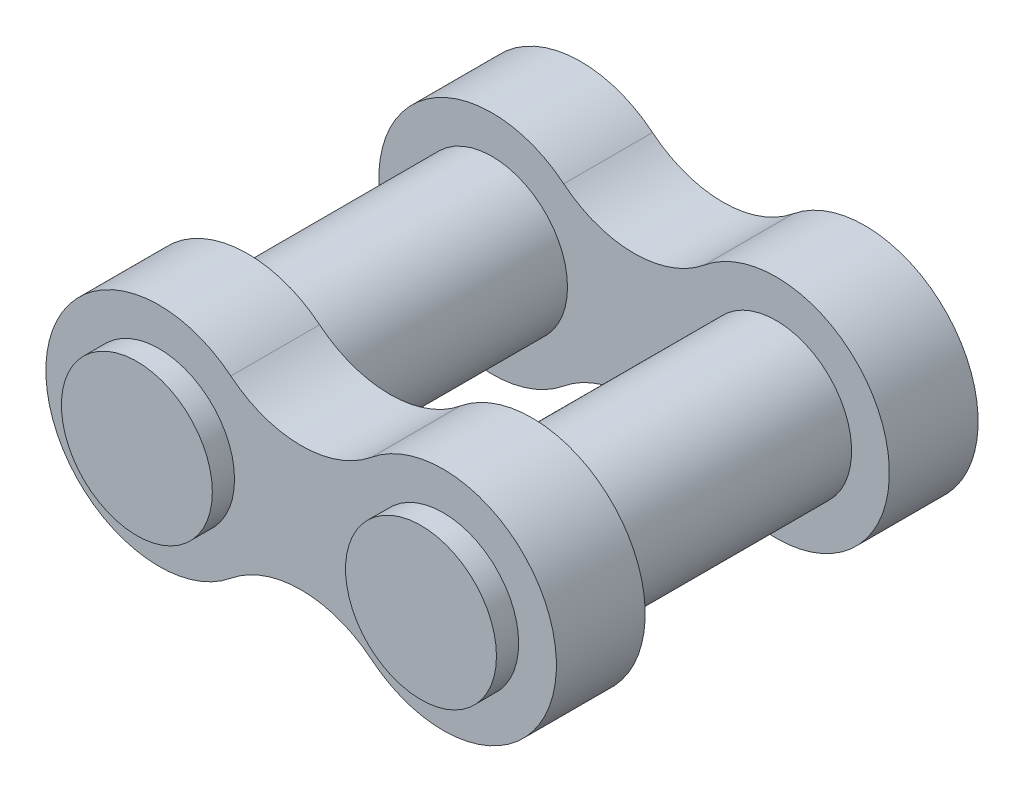
ISO-10303-21;
HEADER;
FILE_DESCRIPTION(('STEP AP214'),'2;1');
FILE_NAME('part.step','',(''),(''),'','','');
FILE_SCHEMA(('AUTOMOTIVE_DESIGN { 1 0 10303 214 1 1 1 1 }'));
ENDSEC;
DATA;
#1=APPLICATION_CONTEXT('core data for automotive mechanical design processes');
#2=APPLICATION_PROTOCOL_DEFINITION('international standard','automotive_design',2000,#1);
#3=PRODUCT_CONTEXT('',#1,'mechanical');
#4=PRODUCT('Part','Part','',(#3));
#5=PRODUCT_RELATED_PRODUCT_CATEGORY('part','',(#4));
#6=PRODUCT_DEFINITION_FORMATION('','',#4);
#7=PRODUCT_DEFINITION_CONTEXT('part definition',#1,'design');
#8=PRODUCT_DEFINITION('design','',#6,#7);
#9=PRODUCT_DEFINITION_SHAPE('','',#8);
#10=(LENGTH_UNIT() NAMED_UNIT(*) SI_UNIT(.MILLI.,.METRE.));
#11=(NAMED_UNIT(*) PLANE_ANGLE_UNIT() SI_UNIT($,.RADIAN.));
#12=(NAMED_UNIT(*) SI_UNIT($,.STERADIAN.) SOLID_ANGLE_UNIT());
#13=UNCERTAINTY_MEASURE_WITH_UNIT(LENGTH_MEASURE(1.E-05),#10,'distance_accuracy_value','');
#14=(GEOMETRIC_REPRESENTATION_CONTEXT(3) GLOBAL_UNCERTAINTY_ASSIGNED_CONTEXT((#13)) GLOBAL_UNIT_ASSIGNED_CONTEXT((#10,
#11,#12)) REPRESENTATION_CONTEXT('',''));
#15=CARTESIAN_POINT('',(0.,0.,0.));
#16=DIRECTION('',(0.,0.,1.));
#17=DIRECTION('',(1.,0.,0.));
#18=AXIS2_PLACEMENT_3D('',#15,#16,#17);
#19=CARTESIAN_POINT('',(1.6,1.95336248556176,2.));
#20=DIRECTION('',(0.,0.,1.));
#21=DIRECTION('',(1.,0.,0.));
#22=AXIS2_PLACEMENT_3D('',#19,#20,#21);
#23=PLANE('',#22);
#24=CARTESIAN_POINT('',(-3.2,0.,2.));
#25=DIRECTION('',(0.,0.,1.));
#26=DIRECTION('',(1.,0.,0.));
#27=AXIS2_PLACEMENT_3D('',#24,#25,#26);
#28=CIRCLE('',#27,1.7);
#29=CARTESIAN_POINT('',(-1.5,0.,2.));
#30=VERTEX_POINT('',#29);
#31=EDGE_CURVE('E179',#30,#30,#28,.T.);
#32=ORIENTED_EDGE('',*,*,#31,.F.);
#33=EDGE_LOOP('',(#32));
#34=FACE_BOUND('',#33,.T.);
#35=CARTESIAN_POINT('',(0.,3.90672497112351,2.));
#36=DIRECTION('',(0.,0.,-1.));
#37=DIRECTION('',(1.,0.,0.));
#38=AXIS2_PLACEMENT_3D('',#35,#36,#37);
#39=CIRCLE('',#38,2.5);
#40=CARTESIAN_POINT('',(1.58415841584159,1.97270270819108,2.));
#41=VERTEX_POINT('',#40);
#42=CARTESIAN_POINT('',(-1.58415841584158,1.97270270819108,2.));
#43=VERTEX_POINT('',#42);
#44=EDGE_CURVE('E184',#41,#43,#39,.T.);
#45=ORIENTED_EDGE('',*,*,#44,.T.);
#46=CARTESIAN_POINT('',(-3.2,0.,2.));
#47=DIRECTION('',(0.,0.,1.));
#48=DIRECTION('',(1.,0.,0.));
#49=AXIS2_PLACEMENT_3D('',#46,#47,#48);
#50=CIRCLE('',#49,2.55);
#51=CARTESIAN_POINT('',(-1.58415841584158,-1.97270270819108,2.));
#52=VERTEX_POINT('',#51);
#53=EDGE_CURVE('E86',#43,#52,#50,.T.);
#54=ORIENTED_EDGE('',*,*,#53,.T.);
#55=CARTESIAN_POINT('',(0.,-3.90672497112351,2.));
#56=DIRECTION('',(0.,0.,-1.));
#57=DIRECTION('',(-1.,0.,0.));
#58=AXIS2_PLACEMENT_3D('',#55,#56,#57);
#59=CIRCLE('',#58,2.5);
#60=CARTESIAN_POINT('',(1.58415841584159,-1.97270270819108,2.));
#61=VERTEX_POINT('',#60);
#62=EDGE_CURVE('E190',#52,#61,#59,.T.);
#63=ORIENTED_EDGE('',*,*,#62,.T.);
#64=CARTESIAN_POINT('',(3.2,0.,2.));
#65=DIRECTION('',(0.,0.,1.));
#66=DIRECTION('',(-1.,0.,0.));
#67=AXIS2_PLACEMENT_3D('',#64,#65,#66);
#68=CIRCLE('',#67,2.55);
#69=EDGE_CURVE('E57',#61,#41,#68,.T.);
#70=ORIENTED_EDGE('',*,*,#69,.T.);
#71=EDGE_LOOP('',(#45,#54,#63,#70));
#72=FACE_BOUND('',#71,.T.);
#73=CARTESIAN_POINT('',(3.2,0.,2.));
#74=DIRECTION('',(0.,0.,1.));
#75=DIRECTION('',(-1.,0.,0.));
#76=AXIS2_PLACEMENT_3D('',#73,#74,#75);
#77=CIRCLE('',#76,1.7);
#78=CARTESIAN_POINT('',(1.5,0.,2.));
#79=VERTEX_POINT('',#78);
#80=EDGE_CURVE('E180',#79,#79,#77,.T.);
#81=ORIENTED_EDGE('',*,*,#80,.F.);
#82=EDGE_LOOP('',(#81));
#83=FACE_BOUND('',#82,.T.);
#84=ADVANCED_FACE('F39',(#34,#72,#83),#23,.T.);
#85=CARTESIAN_POINT('',(1.6,1.95336248556176,0.));
#86=DIRECTION('',(0.,0.,1.));
#87=DIRECTION('',(1.,0.,0.));
#88=AXIS2_PLACEMENT_3D('',#85,#86,#87);
#89=PLANE('',#88);
#90=CARTESIAN_POINT('',(0.,3.90672497112351,0.));
#91=DIRECTION('',(0.,0.,-1.));
#92=DIRECTION('',(1.,0.,0.));
#93=AXIS2_PLACEMENT_3D('',#90,#91,#92);
#94=CIRCLE('',#93,2.5);
#95=CARTESIAN_POINT('',(1.58415841584159,1.97270270819108,0.));
#96=VERTEX_POINT('',#95);
#97=CARTESIAN_POINT('',(-1.58415841584158,1.97270270819108,0.));
#98=VERTEX_POINT('',#97);
#99=EDGE_CURVE('E181',#96,#98,#94,.T.);
#100=ORIENTED_EDGE('',*,*,#99,.F.);
#101=CARTESIAN_POINT('',(3.2,0.,0.));
#102=DIRECTION('',(0.,0.,1.));
#103=DIRECTION('',(-1.,0.,0.));
#104=AXIS2_PLACEMENT_3D('',#101,#102,#103);
#105=CIRCLE('',#104,2.55);
#106=CARTESIAN_POINT('',(1.58415841584159,-1.97270270819108,0.));
#107=VERTEX_POINT('',#106);
#108=EDGE_CURVE('E79',#107,#96,#105,.T.);
#109=ORIENTED_EDGE('',*,*,#108,.F.);
#110=CARTESIAN_POINT('',(0.,-3.90672497112351,0.));
#111=DIRECTION('',(0.,0.,-1.));
#112=DIRECTION('',(-1.,0.,0.));
#113=AXIS2_PLACEMENT_3D('',#110,#111,#112);
#114=CIRCLE('',#113,2.5);
#115=CARTESIAN_POINT('',(-1.58415841584158,-1.97270270819108,0.));
#116=VERTEX_POINT('',#115);
#117=EDGE_CURVE('E74',#116,#107,#114,.T.);
#118=ORIENTED_EDGE('',*,*,#117,.F.);
#119=CARTESIAN_POINT('',(-3.2,0.,0.));
#120=DIRECTION('',(0.,0.,1.));
#121=DIRECTION('',(1.,0.,0.));
#122=AXIS2_PLACEMENT_3D('',#119,#120,#121);
#123=CIRCLE('',#122,2.55);
#124=EDGE_CURVE('E193',#98,#116,#123,.T.);
#125=ORIENTED_EDGE('',*,*,#124,.F.);
#126=EDGE_LOOP('',(#100,#109,#118,#125));
#127=FACE_BOUND('',#126,.T.);
#128=CARTESIAN_POINT('',(-3.2,0.,0.));
#129=DIRECTION('',(0.,0.,1.));
#130=DIRECTION('',(1.,0.,0.));
#131=AXIS2_PLACEMENT_3D('',#128,#129,#130);
#132=CIRCLE('',#131,1.7);
#133=CARTESIAN_POINT('',(-1.5,0.,0.));
#134=VERTEX_POINT('',#133);
#135=EDGE_CURVE('E173',#134,#134,#132,.T.);
#136=ORIENTED_EDGE('',*,*,#135,.T.);
#137=EDGE_LOOP('',(#136));
#138=FACE_BOUND('',#137,.T.);
#139=CARTESIAN_POINT('',(3.2,0.,0.));
#140=DIRECTION('',(0.,0.,1.));
#141=DIRECTION('',(1.,0.,0.));
#142=AXIS2_PLACEMENT_3D('',#139,#140,#141);
#143=CIRCLE('',#142,1.7);
#144=CARTESIAN_POINT('',(4.9,0.,0.));
#145=VERTEX_POINT('',#144);
#146=EDGE_CURVE('E164',#145,#145,#143,.T.);
#147=ORIENTED_EDGE('',*,*,#146,.T.);
#148=EDGE_LOOP('',(#147));
#149=FACE_BOUND('',#148,.T.);
#150=ADVANCED_FACE('F220',(#127,#138,#149),#89,.F.);
#151=CARTESIAN_POINT('',(0.,3.90672497112351,2.));
#152=DIRECTION('',(0.,0.,-1.));
#153=DIRECTION('',(-1.,0.,0.));
#154=AXIS2_PLACEMENT_3D('',#151,#152,#153);
#155=CYLINDRICAL_SURFACE('',#154,2.5);
#156=ORIENTED_EDGE('',*,*,#99,.T.);
#157=DIRECTION('',(0.,0.,-1.));
#158=VECTOR('',#157,1.);
#159=CARTESIAN_POINT('',(-1.58415841584158,1.97270270819108,2.));
#160=LINE('',#159,#158);
#161=EDGE_CURVE('E205',#43,#98,#160,.T.);
#162=ORIENTED_EDGE('',*,*,#161,.F.);
#163=ORIENTED_EDGE('',*,*,#44,.F.);
#164=DIRECTION('',(0.,0.,-1.));
#165=VECTOR('',#164,1.);
#166=CARTESIAN_POINT('',(1.58415841584159,1.97270270819108,2.));
#167=LINE('',#166,#165);
#168=EDGE_CURVE('E189',#41,#96,#167,.T.);
#169=ORIENTED_EDGE('',*,*,#168,.T.);
#170=EDGE_LOOP('',(#156,#162,#163,#169));
#171=FACE_BOUND('',#170,.T.);
#172=ADVANCED_FACE('F41',(#171),#155,.F.);
#173=CARTESIAN_POINT('',(-3.2,0.,2.));
#174=DIRECTION('',(0.,0.,-1.));
#175=DIRECTION('',(-1.,0.,0.));
#176=AXIS2_PLACEMENT_3D('',#173,#174,#175);
#177=CYLINDRICAL_SURFACE('',#176,2.55);
#178=ORIENTED_EDGE('',*,*,#124,.T.);
#179=DIRECTION('',(0.,0.,-1.));
#180=VECTOR('',#179,1.);
#181=CARTESIAN_POINT('',(-1.58415841584158,-1.97270270819108,2.));
#182=LINE('',#181,#180);
#183=EDGE_CURVE('E199',#52,#116,#182,.T.);
#184=ORIENTED_EDGE('',*,*,#183,.F.);
#185=ORIENTED_EDGE('',*,*,#53,.F.);
#186=ORIENTED_EDGE('',*,*,#161,.T.);
#187=EDGE_LOOP('',(#178,#184,#185,#186));
#188=FACE_BOUND('',#187,.T.);
#189=ADVANCED_FACE('F237',(#188),#177,.T.);
#190=CARTESIAN_POINT('',(0.,-3.90672497112351,2.));
#191=DIRECTION('',(0.,0.,-1.));
#192=DIRECTION('',(-1.,0.,0.));
#193=AXIS2_PLACEMENT_3D('',#190,#191,#192);
#194=CYLINDRICAL_SURFACE('',#193,2.5);
#195=ORIENTED_EDGE('',*,*,#117,.T.);
#196=DIRECTION('',(0.,0.,-1.));
#197=VECTOR('',#196,1.);
#198=CARTESIAN_POINT('',(1.58415841584159,-1.97270270819108,2.));
#199=LINE('',#198,#197);
#200=EDGE_CURVE('E196',#61,#107,#199,.T.);
#201=ORIENTED_EDGE('',*,*,#200,.F.);
#202=ORIENTED_EDGE('',*,*,#62,.F.);
#203=ORIENTED_EDGE('',*,*,#183,.T.);
#204=EDGE_LOOP('',(#195,#201,#202,#203));
#205=FACE_BOUND('',#204,.T.);
#206=ADVANCED_FACE('F232',(#205),#194,.F.);
#207=CARTESIAN_POINT('',(3.2,0.,2.));
#208=DIRECTION('',(0.,0.,-1.));
#209=DIRECTION('',(-1.,0.,0.));
#210=AXIS2_PLACEMENT_3D('',#207,#208,#209);
#211=CYLINDRICAL_SURFACE('',#210,2.55);
#212=ORIENTED_EDGE('',*,*,#108,.T.);
#213=ORIENTED_EDGE('',*,*,#168,.F.);
#214=ORIENTED_EDGE('',*,*,#69,.F.);
#215=ORIENTED_EDGE('',*,*,#200,.T.);
#216=EDGE_LOOP('',(#212,#213,#214,#215));
#217=FACE_BOUND('',#216,.T.);
#218=ADVANCED_FACE('F229',(#217),#211,.T.);
#219=CARTESIAN_POINT('',(-3.2,0.,-0.5));
#220=DIRECTION('',(0.,0.,1.));
#221=DIRECTION('',(1.,0.,0.));
#222=AXIS2_PLACEMENT_3D('',#219,#220,#221);
#223=PLANE('',#222);
#224=CARTESIAN_POINT('',(-3.2,0.,-0.5));
#225=DIRECTION('',(0.,0.,1.));
#226=DIRECTION('',(1.,0.,0.));
#227=AXIS2_PLACEMENT_3D('',#224,#225,#226);
#228=CIRCLE('',#227,1.7);
#229=CARTESIAN_POINT('',(-1.5,0.,-0.5));
#230=VERTEX_POINT('',#229);
#231=EDGE_CURVE('E171',#230,#230,#228,.T.);
#232=ORIENTED_EDGE('',*,*,#231,.F.);
#233=EDGE_LOOP('',(#232));
#234=FACE_BOUND('',#233,.T.);
#235=ADVANCED_FACE('F233',(#234),#223,.F.);
#236=CARTESIAN_POINT('',(-3.2,0.,-0.5));
#237=DIRECTION('',(0.,0.,1.));
#238=DIRECTION('',(1.,0.,0.));
#239=AXIS2_PLACEMENT_3D('',#236,#237,#238);
#240=CYLINDRICAL_SURFACE('',#239,1.7);
#241=ORIENTED_EDGE('',*,*,#231,.T.);
#242=EDGE_LOOP('',(#241));
#243=FACE_BOUND('',#242,.T.);
#244=ORIENTED_EDGE('',*,*,#135,.F.);
#245=EDGE_LOOP('',(#244));
#246=FACE_BOUND('',#245,.T.);
#247=ADVANCED_FACE('F342',(#243,#246),#240,.T.);
#248=CARTESIAN_POINT('',(-3.2,0.,7.5));
#249=DIRECTION('',(0.,0.,-1.));
#250=DIRECTION('',(-1.,0.,0.));
#251=AXIS2_PLACEMENT_3D('',#248,#249,#250);
#252=CIRCLE('',#251,1.7);
#253=CARTESIAN_POINT('',(-4.9,0.,7.5));
#254=VERTEX_POINT('',#253);
#255=EDGE_CURVE('E11',#254,#254,#252,.F.);
#256=ORIENTED_EDGE('',*,*,#255,.F.);
#257=EDGE_LOOP('',(#256));
#258=FACE_BOUND('',#257,.T.);
#259=ORIENTED_EDGE('',*,*,#31,.T.);
#260=EDGE_LOOP('',(#259));
#261=FACE_BOUND('',#260,.T.);
#262=ADVANCED_FACE('F230',(#258,#261),#240,.T.);
#263=CARTESIAN_POINT('',(3.2,0.,-0.5));
#264=DIRECTION('',(0.,0.,1.));
#265=DIRECTION('',(1.,0.,0.));
#266=AXIS2_PLACEMENT_3D('',#263,#264,#265);
#267=PLANE('',#266);
#268=CARTESIAN_POINT('',(3.2,0.,-0.5));
#269=DIRECTION('',(0.,0.,1.));
#270=DIRECTION('',(1.,0.,0.));
#271=AXIS2_PLACEMENT_3D('',#268,#269,#270);
#272=CIRCLE('',#271,1.7);
#273=CARTESIAN_POINT('',(4.9,0.,-0.5));
#274=VERTEX_POINT('',#273);
#275=EDGE_CURVE('E165',#274,#274,#272,.T.);
#276=ORIENTED_EDGE('',*,*,#275,.F.);
#277=EDGE_LOOP('',(#276));
#278=FACE_BOUND('',#277,.T.);
#279=ADVANCED_FACE('F252',(#278),#267,.F.);
#280=CARTESIAN_POINT('',(3.2,0.,-0.5));
#281=DIRECTION('',(0.,0.,1.));
#282=DIRECTION('',(1.,0.,0.));
#283=AXIS2_PLACEMENT_3D('',#280,#281,#282);
#284=CYLINDRICAL_SURFACE('',#283,1.7);
#285=ORIENTED_EDGE('',*,*,#275,.T.);
#286=EDGE_LOOP('',(#285));
#287=FACE_BOUND('',#286,.T.);
#288=ORIENTED_EDGE('',*,*,#146,.F.);
#289=EDGE_LOOP('',(#288));
#290=FACE_BOUND('',#289,.T.);
#291=ADVANCED_FACE('F211',(#287,#290),#284,.T.);
#292=CARTESIAN_POINT('',(3.2,0.,7.5));
#293=DIRECTION('',(0.,0.,-1.));
#294=DIRECTION('',(-1.,0.,0.));
#295=AXIS2_PLACEMENT_3D('',#292,#293,#294);
#296=CIRCLE('',#295,1.7);
#297=CARTESIAN_POINT('',(1.5,0.,7.5));
#298=VERTEX_POINT('',#297);
#299=EDGE_CURVE('E48',#298,#298,#296,.F.);
#300=ORIENTED_EDGE('',*,*,#299,.F.);
#301=EDGE_LOOP('',(#300));
#302=FACE_BOUND('',#301,.T.);
#303=ORIENTED_EDGE('',*,*,#80,.T.);
#304=EDGE_LOOP('',(#303));
#305=FACE_BOUND('',#304,.T.);
#306=ADVANCED_FACE('F208',(#302,#305),#284,.T.);
#307=CARTESIAN_POINT('',(0.,3.90672497112351,7.5));
#308=DIRECTION('',(0.,0.,1.));
#309=DIRECTION('',(1.,0.,0.));
#310=AXIS2_PLACEMENT_3D('',#307,#308,#309);
#311=CYLINDRICAL_SURFACE('',#310,2.5);
#312=CARTESIAN_POINT('',(0.,3.90672497112351,9.5));
#313=DIRECTION('',(0.,0.,-1.));
#314=DIRECTION('',(1.,0.,0.));
#315=AXIS2_PLACEMENT_3D('',#312,#313,#314);
#316=CIRCLE('',#315,2.5);
#317=CARTESIAN_POINT('',(1.58415841584159,1.97270270819108,9.5));
#318=VERTEX_POINT('',#317);
#319=CARTESIAN_POINT('',(-1.58415841584158,1.97270270819108,9.5));
#320=VERTEX_POINT('',#319);
#321=EDGE_CURVE('E121',#318,#320,#316,.T.);
#322=ORIENTED_EDGE('',*,*,#321,.F.);
#323=DIRECTION('',(0.,0.,1.));
#324=VECTOR('',#323,1.);
#325=CARTESIAN_POINT('',(1.58415841584159,1.97270270819108,7.5));
#326=LINE('',#325,#324);
#327=CARTESIAN_POINT('',(1.58415841584159,1.97270270819108,7.5));
#328=VERTEX_POINT('',#327);
#329=EDGE_CURVE('E113',#328,#318,#326,.T.);
#330=ORIENTED_EDGE('',*,*,#329,.F.);
#331=CARTESIAN_POINT('',(0.,3.90672497112351,7.5));
#332=DIRECTION('',(0.,0.,-1.));
#333=DIRECTION('',(1.,0.,0.));
#334=AXIS2_PLACEMENT_3D('',#331,#332,#333);
#335=CIRCLE('',#334,2.5);
#336=CARTESIAN_POINT('',(-1.58415841584158,1.97270270819108,7.5));
#337=VERTEX_POINT('',#336);
#338=EDGE_CURVE('E117',#328,#337,#335,.T.);
#339=ORIENTED_EDGE('',*,*,#338,.T.);
#340=DIRECTION('',(0.,0.,1.));
#341=VECTOR('',#340,1.);
#342=CARTESIAN_POINT('',(-1.58415841584158,1.97270270819108,7.5));
#343=LINE('',#342,#341);
#344=EDGE_CURVE('E148',#337,#320,#343,.T.);
#345=ORIENTED_EDGE('',*,*,#344,.T.);
#346=EDGE_LOOP('',(#322,#330,#339,#345));
#347=FACE_BOUND('',#346,.T.);
#348=ADVANCED_FACE('F120',(#347),#311,.F.);
#349=CARTESIAN_POINT('',(3.2,0.,7.5));
#350=DIRECTION('',(0.,0.,1.));
#351=DIRECTION('',(1.,0.,0.));
#352=AXIS2_PLACEMENT_3D('',#349,#350,#351);
#353=CYLINDRICAL_SURFACE('',#352,2.55);
#354=CARTESIAN_POINT('',(3.2,0.,9.5));
#355=DIRECTION('',(0.,0.,1.));
#356=DIRECTION('',(-1.,0.,0.));
#357=AXIS2_PLACEMENT_3D('',#354,#355,#356);
#358=CIRCLE('',#357,2.55);
#359=CARTESIAN_POINT('',(1.58415841584159,-1.97270270819108,9.5));
#360=VERTEX_POINT('',#359);
#361=EDGE_CURVE('E146',#360,#318,#358,.T.);
#362=ORIENTED_EDGE('',*,*,#361,.F.);
#363=DIRECTION('',(0.,0.,1.));
#364=VECTOR('',#363,1.);
#365=CARTESIAN_POINT('',(1.58415841584159,-1.97270270819108,7.5));
#366=LINE('',#365,#364);
#367=CARTESIAN_POINT('',(1.58415841584159,-1.97270270819108,7.5));
#368=VERTEX_POINT('',#367);
#369=EDGE_CURVE('E130',#368,#360,#366,.T.);
#370=ORIENTED_EDGE('',*,*,#369,.F.);
#371=CARTESIAN_POINT('',(3.2,0.,7.5));
#372=DIRECTION('',(0.,0.,1.));
#373=DIRECTION('',(-1.,0.,0.));
#374=AXIS2_PLACEMENT_3D('',#371,#372,#373);
#375=CIRCLE('',#374,2.55);
#376=EDGE_CURVE('E132',#368,#328,#375,.T.);
#377=ORIENTED_EDGE('',*,*,#376,.T.);
#378=ORIENTED_EDGE('',*,*,#329,.T.);
#379=EDGE_LOOP('',(#362,#370,#377,#378));
#380=FACE_BOUND('',#379,.T.);
#381=ADVANCED_FACE('F137',(#380),#353,.T.);
#382=CARTESIAN_POINT('',(0.,-3.90672497112351,7.5));
#383=DIRECTION('',(0.,0.,1.));
#384=DIRECTION('',(1.,0.,0.));
#385=AXIS2_PLACEMENT_3D('',#382,#383,#384);
#386=CYLINDRICAL_SURFACE('',#385,2.5);
#387=CARTESIAN_POINT('',(0.,-3.90672497112351,9.5));
#388=DIRECTION('',(0.,0.,-1.));
#389=DIRECTION('',(-1.,0.,0.));
#390=AXIS2_PLACEMENT_3D('',#387,#388,#389);
#391=CIRCLE('',#390,2.5);
#392=CARTESIAN_POINT('',(-1.58415841584158,-1.97270270819108,9.5));
#393=VERTEX_POINT('',#392);
#394=EDGE_CURVE('E151',#393,#360,#391,.T.);
#395=ORIENTED_EDGE('',*,*,#394,.F.);
#396=DIRECTION('',(0.,0.,1.));
#397=VECTOR('',#396,1.);
#398=CARTESIAN_POINT('',(-1.58415841584158,-1.97270270819108,7.5));
#399=LINE('',#398,#397);
#400=CARTESIAN_POINT('',(-1.58415841584158,-1.97270270819108,7.5));
#401=VERTEX_POINT('',#400);
#402=EDGE_CURVE('E160',#401,#393,#399,.T.);
#403=ORIENTED_EDGE('',*,*,#402,.F.);
#404=CARTESIAN_POINT('',(0.,-3.90672497112351,7.5));
#405=DIRECTION('',(0.,0.,-1.));
#406=DIRECTION('',(-1.,0.,0.));
#407=AXIS2_PLACEMENT_3D('',#404,#405,#406);
#408=CIRCLE('',#407,2.5);
#409=EDGE_CURVE('E139',#401,#368,#408,.T.);
#410=ORIENTED_EDGE('',*,*,#409,.T.);
#411=ORIENTED_EDGE('',*,*,#369,.T.);
#412=EDGE_LOOP('',(#395,#403,#410,#411));
#413=FACE_BOUND('',#412,.T.);
#414=ADVANCED_FACE('F292',(#413),#386,.F.);
#415=CARTESIAN_POINT('',(-3.2,0.,7.5));
#416=DIRECTION('',(0.,0.,1.));
#417=DIRECTION('',(1.,0.,0.));
#418=AXIS2_PLACEMENT_3D('',#415,#416,#417);
#419=CYLINDRICAL_SURFACE('',#418,2.55);
#420=CARTESIAN_POINT('',(-3.2,0.,9.5));
#421=DIRECTION('',(0.,0.,1.));
#422=DIRECTION('',(1.,0.,0.));
#423=AXIS2_PLACEMENT_3D('',#420,#421,#422);
#424=CIRCLE('',#423,2.55);
#425=EDGE_CURVE('E140',#320,#393,#424,.T.);
#426=ORIENTED_EDGE('',*,*,#425,.F.);
#427=ORIENTED_EDGE('',*,*,#344,.F.);
#428=CARTESIAN_POINT('',(-3.2,0.,7.5));
#429=DIRECTION('',(0.,0.,1.));
#430=DIRECTION('',(1.,0.,0.));
#431=AXIS2_PLACEMENT_3D('',#428,#429,#430);
#432=CIRCLE('',#431,2.55);
#433=EDGE_CURVE('E136',#337,#401,#432,.T.);
#434=ORIENTED_EDGE('',*,*,#433,.T.);
#435=ORIENTED_EDGE('',*,*,#402,.T.);
#436=EDGE_LOOP('',(#426,#427,#434,#435));
#437=FACE_BOUND('',#436,.T.);
#438=ADVANCED_FACE('F288',(#437),#419,.T.);
#439=CARTESIAN_POINT('',(1.6,1.95336248556176,7.5));
#440=DIRECTION('',(0.,0.,-1.));
#441=DIRECTION('',(1.,0.,0.));
#442=AXIS2_PLACEMENT_3D('',#439,#440,#441);
#443=PLANE('',#442);
#444=ORIENTED_EDGE('',*,*,#299,.T.);
#445=EDGE_LOOP('',(#444));
#446=FACE_BOUND('',#445,.T.);
#447=ORIENTED_EDGE('',*,*,#255,.T.);
#448=EDGE_LOOP('',(#447));
#449=FACE_BOUND('',#448,.T.);
#450=ORIENTED_EDGE('',*,*,#338,.F.);
#451=ORIENTED_EDGE('',*,*,#376,.F.);
#452=ORIENTED_EDGE('',*,*,#409,.F.);
#453=ORIENTED_EDGE('',*,*,#433,.F.);
#454=EDGE_LOOP('',(#450,#451,#452,#453));
#455=FACE_BOUND('',#454,.T.);
#456=ADVANCED_FACE('F131',(#446,#449,#455),#443,.T.);
#457=CARTESIAN_POINT('',(1.6,1.95336248556176,9.5));
#458=DIRECTION('',(0.,0.,-1.));
#459=DIRECTION('',(1.,0.,0.));
#460=AXIS2_PLACEMENT_3D('',#457,#458,#459);
#461=PLANE('',#460);
#462=CARTESIAN_POINT('',(3.2,0.,9.5));
#463=DIRECTION('',(0.,0.,1.));
#464=DIRECTION('',(-1.,0.,0.));
#465=AXIS2_PLACEMENT_3D('',#462,#463,#464);
#466=CIRCLE('',#465,1.7);
#467=CARTESIAN_POINT('',(1.5,0.,9.5));
#468=VERTEX_POINT('',#467);
#469=EDGE_CURVE('E273',#468,#468,#466,.T.);
#470=ORIENTED_EDGE('',*,*,#469,.F.);
#471=EDGE_LOOP('',(#470));
#472=FACE_BOUND('',#471,.T.);
#473=CARTESIAN_POINT('',(-3.2,0.,9.5));
#474=DIRECTION('',(0.,0.,1.));
#475=DIRECTION('',(1.,0.,0.));
#476=AXIS2_PLACEMENT_3D('',#473,#474,#475);
#477=CIRCLE('',#476,1.7);
#478=CARTESIAN_POINT('',(-1.5,0.,9.5));
#479=VERTEX_POINT('',#478);
#480=EDGE_CURVE('E149',#479,#479,#477,.T.);
#481=ORIENTED_EDGE('',*,*,#480,.F.);
#482=EDGE_LOOP('',(#481));
#483=FACE_BOUND('',#482,.T.);
#484=ORIENTED_EDGE('',*,*,#321,.T.);
#485=ORIENTED_EDGE('',*,*,#425,.T.);
#486=ORIENTED_EDGE('',*,*,#394,.T.);
#487=ORIENTED_EDGE('',*,*,#361,.T.);
#488=EDGE_LOOP('',(#484,#485,#486,#487));
#489=FACE_BOUND('',#488,.T.);
#490=ADVANCED_FACE('F281',(#472,#483,#489),#461,.F.);
#491=CARTESIAN_POINT('',(-3.2,0.,10.));
#492=DIRECTION('',(0.,0.,1.));
#493=DIRECTION('',(1.,0.,0.));
#494=AXIS2_PLACEMENT_3D('',#491,#492,#493);
#495=PLANE('',#494);
#496=CARTESIAN_POINT('',(-3.2,0.,10.));
#497=DIRECTION('',(0.,0.,1.));
#498=DIRECTION('',(1.,0.,0.));
#499=AXIS2_PLACEMENT_3D('',#496,#497,#498);
#500=CIRCLE('',#499,1.7);
#501=CARTESIAN_POINT('',(-1.5,0.,10.));
#502=VERTEX_POINT('',#501);
#503=EDGE_CURVE('E169',#502,#502,#500,.T.);
#504=ORIENTED_EDGE('',*,*,#503,.T.);
#505=EDGE_LOOP('',(#504));
#506=FACE_BOUND('',#505,.T.);
#507=ADVANCED_FACE('F283',(#506),#495,.T.);
#508=ORIENTED_EDGE('',*,*,#503,.F.);
#509=EDGE_LOOP('',(#508));
#510=FACE_BOUND('',#509,.T.);
#511=ORIENTED_EDGE('',*,*,#480,.T.);
#512=EDGE_LOOP('',(#511));
#513=FACE_BOUND('',#512,.T.);
#514=ADVANCED_FACE('F270',(#510,#513),#240,.T.);
#515=CARTESIAN_POINT('',(3.2,0.,10.));
#516=DIRECTION('',(0.,0.,1.));
#517=DIRECTION('',(1.,0.,0.));
#518=AXIS2_PLACEMENT_3D('',#515,#516,#517);
#519=PLANE('',#518);
#520=CARTESIAN_POINT('',(3.2,0.,10.));
#521=DIRECTION('',(0.,0.,1.));
#522=DIRECTION('',(1.,0.,0.));
#523=AXIS2_PLACEMENT_3D('',#520,#521,#522);
#524=CIRCLE('',#523,1.7);
#525=CARTESIAN_POINT('',(4.9,0.,10.));
#526=VERTEX_POINT('',#525);
#527=EDGE_CURVE('E127',#526,#526,#524,.T.);
#528=ORIENTED_EDGE('',*,*,#527,.T.);
#529=EDGE_LOOP('',(#528));
#530=FACE_BOUND('',#529,.T.);
#531=ADVANCED_FACE('F265',(#530),#519,.T.);
#532=ORIENTED_EDGE('',*,*,#527,.F.);
#533=EDGE_LOOP('',(#532));
#534=FACE_BOUND('',#533,.T.);
#535=ORIENTED_EDGE('',*,*,#469,.T.);
#536=EDGE_LOOP('',(#535));
#537=FACE_BOUND('',#536,.T.);
#538=ADVANCED_FACE('F213',(#534,#537),#284,.T.);
#539=CLOSED_SHELL('',(#84,#150,#172,#189,#206,#218,#235,#247,#262,#279,#291,#306,#348,#381,#414,
#438,#456,#490,#507,#514,#531,#538));
#540=MANIFOLD_SOLID_BREP('B2',#539);
#541=ADVANCED_BREP_SHAPE_REPRESENTATION('',(#18,#540),#14);
#542=SHAPE_DEFINITION_REPRESENTATION(#9,#541);
ENDSEC;
END-ISO-10303-21;
